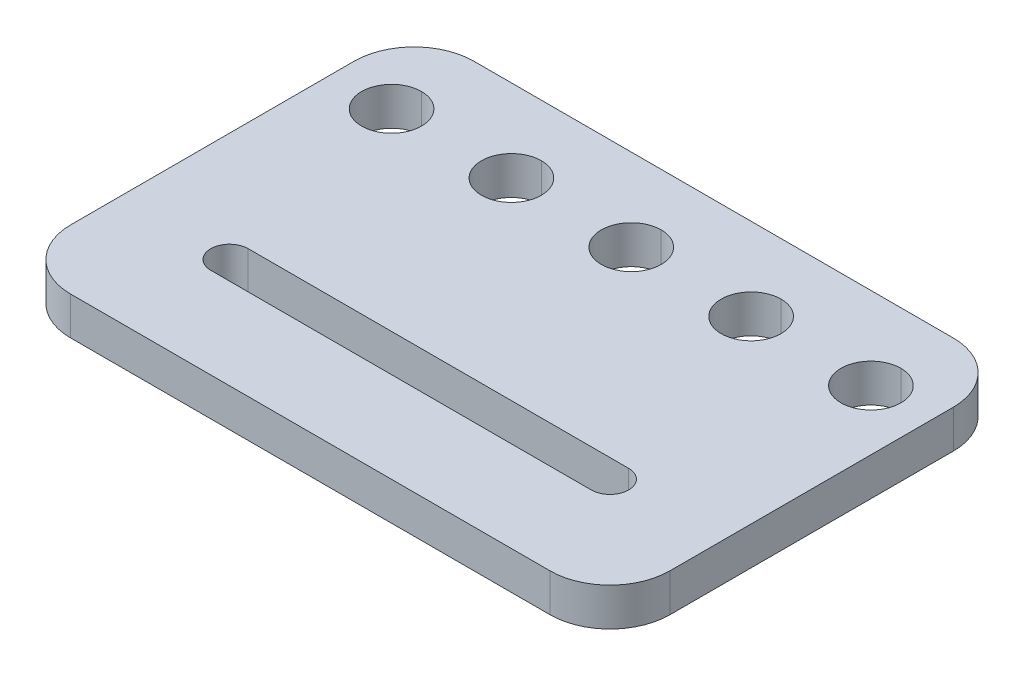
ISO-10303-21;
HEADER;
FILE_DESCRIPTION(('STEP AP214'),'2;1');
FILE_NAME('part.step','',(''),(''),'','','');
FILE_SCHEMA(('AUTOMOTIVE_DESIGN { 1 0 10303 214 1 1 1 1 }'));
ENDSEC;
DATA;
#1=APPLICATION_CONTEXT('core data for automotive mechanical design processes');
#2=APPLICATION_PROTOCOL_DEFINITION('international standard','automotive_design',2000,#1);
#3=PRODUCT_CONTEXT('',#1,'mechanical');
#4=PRODUCT('Part','Part','',(#3));
#5=PRODUCT_RELATED_PRODUCT_CATEGORY('part','',(#4));
#6=PRODUCT_DEFINITION_FORMATION('','',#4);
#7=PRODUCT_DEFINITION_CONTEXT('part definition',#1,'design');
#8=PRODUCT_DEFINITION('design','',#6,#7);
#9=PRODUCT_DEFINITION_SHAPE('','',#8);
#10=(LENGTH_UNIT() NAMED_UNIT(*) SI_UNIT(.MILLI.,.METRE.));
#11=(NAMED_UNIT(*) PLANE_ANGLE_UNIT() SI_UNIT($,.RADIAN.));
#12=(NAMED_UNIT(*) SI_UNIT($,.STERADIAN.) SOLID_ANGLE_UNIT());
#13=UNCERTAINTY_MEASURE_WITH_UNIT(LENGTH_MEASURE(1.E-05),#10,'distance_accuracy_value','');
#14=(GEOMETRIC_REPRESENTATION_CONTEXT(3) GLOBAL_UNCERTAINTY_ASSIGNED_CONTEXT((#13)) GLOBAL_UNIT_ASSIGNED_CONTEXT((#10,
#11,#12)) REPRESENTATION_CONTEXT('',''));
#15=CARTESIAN_POINT('',(0.,0.,0.));
#16=DIRECTION('',(0.,0.,1.));
#17=DIRECTION('',(1.,0.,0.));
#18=AXIS2_PLACEMENT_3D('',#15,#16,#17);
#19=CARTESIAN_POINT('',(20.,2.54,2.));
#20=DIRECTION('',(0.,-1.,0.));
#21=DIRECTION('',(0.,0.,-1.));
#22=AXIS2_PLACEMENT_3D('',#19,#20,#21);
#23=CYLINDRICAL_SURFACE('',#22,2.);
#24=CARTESIAN_POINT('',(20.,2.54,2.));
#25=DIRECTION('',(0.,-1.,0.));
#26=DIRECTION('',(0.,0.,-1.));
#27=AXIS2_PLACEMENT_3D('',#24,#25,#26);
#28=CIRCLE('',#27,2.);
#29=CARTESIAN_POINT('',(20.,2.54,4.));
#30=VERTEX_POINT('',#29);
#31=CARTESIAN_POINT('',(20.,2.54,0.));
#32=VERTEX_POINT('',#31);
#33=EDGE_CURVE('E41',#30,#32,#28,.T.);
#34=ORIENTED_EDGE('',*,*,#33,.F.);
#35=DIRECTION('',(0.,-1.,0.));
#36=VECTOR('',#35,1.);
#37=CARTESIAN_POINT('',(20.,2.54,4.));
#38=LINE('',#37,#36);
#39=CARTESIAN_POINT('',(20.,0.,4.));
#40=VERTEX_POINT('',#39);
#41=EDGE_CURVE('E11',#30,#40,#38,.T.);
#42=ORIENTED_EDGE('',*,*,#41,.T.);
#43=CARTESIAN_POINT('',(20.,0.,2.));
#44=DIRECTION('',(0.,-1.,0.));
#45=DIRECTION('',(0.,0.,-1.));
#46=AXIS2_PLACEMENT_3D('',#43,#44,#45);
#47=CIRCLE('',#46,2.);
#48=CARTESIAN_POINT('',(20.,0.,0.));
#49=VERTEX_POINT('',#48);
#50=EDGE_CURVE('E27',#40,#49,#47,.T.);
#51=ORIENTED_EDGE('',*,*,#50,.T.);
#52=DIRECTION('',(0.,-1.,0.));
#53=VECTOR('',#52,1.);
#54=CARTESIAN_POINT('',(20.,2.54,0.));
#55=LINE('',#54,#53);
#56=EDGE_CURVE('E333',#32,#49,#55,.T.);
#57=ORIENTED_EDGE('',*,*,#56,.F.);
#58=EDGE_LOOP('',(#34,#42,#51,#57));
#59=FACE_BOUND('',#58,.T.);
#60=ADVANCED_FACE('F16',(#59),#23,.F.);
#61=CARTESIAN_POINT('',(12.,2.54,2.));
#62=DIRECTION('',(0.,-1.,0.));
#63=DIRECTION('',(0.,0.,-1.));
#64=AXIS2_PLACEMENT_3D('',#61,#62,#63);
#65=CYLINDRICAL_SURFACE('',#64,2.);
#66=CARTESIAN_POINT('',(12.,2.54,2.));
#67=DIRECTION('',(0.,1.,0.));
#68=DIRECTION('',(0.,0.,1.));
#69=AXIS2_PLACEMENT_3D('',#66,#67,#68);
#70=CIRCLE('',#69,2.);
#71=CARTESIAN_POINT('',(12.,2.54,0.));
#72=VERTEX_POINT('',#71);
#73=CARTESIAN_POINT('',(12.,2.54,4.));
#74=VERTEX_POINT('',#73);
#75=EDGE_CURVE('E306',#72,#74,#70,.T.);
#76=ORIENTED_EDGE('',*,*,#75,.T.);
#77=DIRECTION('',(0.,-1.,0.));
#78=VECTOR('',#77,1.);
#79=CARTESIAN_POINT('',(12.,2.54,4.));
#80=LINE('',#79,#78);
#81=CARTESIAN_POINT('',(12.,0.,4.));
#82=VERTEX_POINT('',#81);
#83=EDGE_CURVE('E302',#74,#82,#80,.T.);
#84=ORIENTED_EDGE('',*,*,#83,.T.);
#85=CARTESIAN_POINT('',(12.,0.,2.));
#86=DIRECTION('',(0.,1.,0.));
#87=DIRECTION('',(0.,0.,1.));
#88=AXIS2_PLACEMENT_3D('',#85,#86,#87);
#89=CIRCLE('',#88,2.);
#90=CARTESIAN_POINT('',(12.,0.,0.));
#91=VERTEX_POINT('',#90);
#92=EDGE_CURVE('E287',#91,#82,#89,.T.);
#93=ORIENTED_EDGE('',*,*,#92,.F.);
#94=DIRECTION('',(0.,-1.,0.));
#95=VECTOR('',#94,1.);
#96=CARTESIAN_POINT('',(12.,2.54,0.));
#97=LINE('',#96,#95);
#98=EDGE_CURVE('E264',#72,#91,#97,.T.);
#99=ORIENTED_EDGE('',*,*,#98,.F.);
#100=EDGE_LOOP('',(#76,#84,#93,#99));
#101=FACE_BOUND('',#100,.T.);
#102=ADVANCED_FACE('F719',(#101),#65,.F.);
#103=CARTESIAN_POINT('',(4.,2.54,2.));
#104=DIRECTION('',(0.,-1.,0.));
#105=DIRECTION('',(0.,0.,-1.));
#106=AXIS2_PLACEMENT_3D('',#103,#104,#105);
#107=CYLINDRICAL_SURFACE('',#106,2.);
#108=CARTESIAN_POINT('',(4.,2.54,2.));
#109=DIRECTION('',(0.,1.,0.));
#110=DIRECTION('',(0.,0.,1.));
#111=AXIS2_PLACEMENT_3D('',#108,#109,#110);
#112=CIRCLE('',#111,2.);
#113=CARTESIAN_POINT('',(4.,2.54,0.));
#114=VERTEX_POINT('',#113);
#115=CARTESIAN_POINT('',(4.,2.54,4.));
#116=VERTEX_POINT('',#115);
#117=EDGE_CURVE('E307',#114,#116,#112,.T.);
#118=ORIENTED_EDGE('',*,*,#117,.T.);
#119=DIRECTION('',(0.,-1.,0.));
#120=VECTOR('',#119,1.);
#121=CARTESIAN_POINT('',(4.,2.54,4.));
#122=LINE('',#121,#120);
#123=CARTESIAN_POINT('',(4.,0.,4.));
#124=VERTEX_POINT('',#123);
#125=EDGE_CURVE('E312',#116,#124,#122,.T.);
#126=ORIENTED_EDGE('',*,*,#125,.T.);
#127=CARTESIAN_POINT('',(4.,0.,2.));
#128=DIRECTION('',(0.,1.,0.));
#129=DIRECTION('',(0.,0.,1.));
#130=AXIS2_PLACEMENT_3D('',#127,#128,#129);
#131=CIRCLE('',#130,2.);
#132=CARTESIAN_POINT('',(4.,0.,0.));
#133=VERTEX_POINT('',#132);
#134=EDGE_CURVE('E301',#133,#124,#131,.T.);
#135=ORIENTED_EDGE('',*,*,#134,.F.);
#136=DIRECTION('',(0.,-1.,0.));
#137=VECTOR('',#136,1.);
#138=CARTESIAN_POINT('',(4.,2.54,0.));
#139=LINE('',#138,#137);
#140=EDGE_CURVE('E263',#114,#133,#139,.T.);
#141=ORIENTED_EDGE('',*,*,#140,.F.);
#142=EDGE_LOOP('',(#118,#126,#135,#141));
#143=FACE_BOUND('',#142,.T.);
#144=ADVANCED_FACE('F723',(#143),#107,.F.);
#145=CARTESIAN_POINT('',(-4.,2.54,2.));
#146=DIRECTION('',(0.,-1.,0.));
#147=DIRECTION('',(0.,0.,-1.));
#148=AXIS2_PLACEMENT_3D('',#145,#146,#147);
#149=CYLINDRICAL_SURFACE('',#148,2.);
#150=CARTESIAN_POINT('',(-4.,2.54,2.));
#151=DIRECTION('',(0.,1.,0.));
#152=DIRECTION('',(0.,0.,1.));
#153=AXIS2_PLACEMENT_3D('',#150,#151,#152);
#154=CIRCLE('',#153,2.);
#155=CARTESIAN_POINT('',(-4.,2.54,0.));
#156=VERTEX_POINT('',#155);
#157=CARTESIAN_POINT('',(-4.,2.54,4.));
#158=VERTEX_POINT('',#157);
#159=EDGE_CURVE('E308',#156,#158,#154,.T.);
#160=ORIENTED_EDGE('',*,*,#159,.T.);
#161=DIRECTION('',(0.,-1.,0.));
#162=VECTOR('',#161,1.);
#163=CARTESIAN_POINT('',(-4.,2.54,4.));
#164=LINE('',#163,#162);
#165=CARTESIAN_POINT('',(-4.,0.,4.));
#166=VERTEX_POINT('',#165);
#167=EDGE_CURVE('E313',#158,#166,#164,.T.);
#168=ORIENTED_EDGE('',*,*,#167,.T.);
#169=CARTESIAN_POINT('',(-4.,0.,2.));
#170=DIRECTION('',(0.,1.,0.));
#171=DIRECTION('',(0.,0.,1.));
#172=AXIS2_PLACEMENT_3D('',#169,#170,#171);
#173=CIRCLE('',#172,2.);
#174=CARTESIAN_POINT('',(-4.,0.,0.));
#175=VERTEX_POINT('',#174);
#176=EDGE_CURVE('E286',#175,#166,#173,.T.);
#177=ORIENTED_EDGE('',*,*,#176,.F.);
#178=DIRECTION('',(0.,-1.,0.));
#179=VECTOR('',#178,1.);
#180=CARTESIAN_POINT('',(-4.,2.54,0.));
#181=LINE('',#180,#179);
#182=EDGE_CURVE('E318',#156,#175,#181,.T.);
#183=ORIENTED_EDGE('',*,*,#182,.F.);
#184=EDGE_LOOP('',(#160,#168,#177,#183));
#185=FACE_BOUND('',#184,.T.);
#186=ADVANCED_FACE('F693',(#185),#149,.F.);
#187=CARTESIAN_POINT('',(-12.,2.54,2.));
#188=DIRECTION('',(0.,-1.,0.));
#189=DIRECTION('',(0.,0.,-1.));
#190=AXIS2_PLACEMENT_3D('',#187,#188,#189);
#191=CYLINDRICAL_SURFACE('',#190,2.);
#192=CARTESIAN_POINT('',(-12.,2.54,2.));
#193=DIRECTION('',(0.,1.,0.));
#194=DIRECTION('',(0.,0.,1.));
#195=AXIS2_PLACEMENT_3D('',#192,#193,#194);
#196=CIRCLE('',#195,2.);
#197=CARTESIAN_POINT('',(-12.,2.54,0.));
#198=VERTEX_POINT('',#197);
#199=CARTESIAN_POINT('',(-12.,2.54,4.));
#200=VERTEX_POINT('',#199);
#201=EDGE_CURVE('E383',#198,#200,#196,.T.);
#202=ORIENTED_EDGE('',*,*,#201,.T.);
#203=DIRECTION('',(0.,-1.,0.));
#204=VECTOR('',#203,1.);
#205=CARTESIAN_POINT('',(-12.,2.54,4.));
#206=LINE('',#205,#204);
#207=CARTESIAN_POINT('',(-12.,0.,4.));
#208=VERTEX_POINT('',#207);
#209=EDGE_CURVE('E358',#200,#208,#206,.T.);
#210=ORIENTED_EDGE('',*,*,#209,.T.);
#211=CARTESIAN_POINT('',(-12.,0.,2.));
#212=DIRECTION('',(0.,1.,0.));
#213=DIRECTION('',(0.,0.,1.));
#214=AXIS2_PLACEMENT_3D('',#211,#212,#213);
#215=CIRCLE('',#214,2.);
#216=CARTESIAN_POINT('',(-12.,0.,0.));
#217=VERTEX_POINT('',#216);
#218=EDGE_CURVE('E265',#217,#208,#215,.T.);
#219=ORIENTED_EDGE('',*,*,#218,.F.);
#220=DIRECTION('',(0.,-1.,0.));
#221=VECTOR('',#220,1.);
#222=CARTESIAN_POINT('',(-12.,2.54,0.));
#223=LINE('',#222,#221);
#224=EDGE_CURVE('E258',#198,#217,#223,.T.);
#225=ORIENTED_EDGE('',*,*,#224,.F.);
#226=EDGE_LOOP('',(#202,#210,#219,#225));
#227=FACE_BOUND('',#226,.T.);
#228=ADVANCED_FACE('F688',(#227),#191,.F.);
#229=CARTESIAN_POINT('',(0.,2.54,0.));
#230=DIRECTION('',(0.,-1.,0.));
#231=DIRECTION('',(0.,0.,-1.));
#232=AXIS2_PLACEMENT_3D('',#229,#230,#231);
#233=PLANE('',#232);
#234=DIRECTION('',(1.,0.,0.));
#235=VECTOR('',#234,1.);
#236=CARTESIAN_POINT('',(0.,2.54,23.42));
#237=LINE('',#236,#235);
#238=CARTESIAN_POINT('',(-12.,2.54,23.42));
#239=VERTEX_POINT('',#238);
#240=CARTESIAN_POINT('',(20.,2.54,23.42));
#241=VERTEX_POINT('',#240);
#242=EDGE_CURVE('E280',#239,#241,#237,.T.);
#243=ORIENTED_EDGE('',*,*,#242,.T.);
#244=CARTESIAN_POINT('',(20.,2.54,19.42));
#245=DIRECTION('',(0.,1.,0.));
#246=DIRECTION('',(0.,0.,-1.));
#247=AXIS2_PLACEMENT_3D('',#244,#245,#246);
#248=CIRCLE('',#247,4.);
#249=CARTESIAN_POINT('',(24.,2.54,19.42));
#250=VERTEX_POINT('',#249);
#251=EDGE_CURVE('E276',#241,#250,#248,.T.);
#252=ORIENTED_EDGE('',*,*,#251,.T.);
#253=DIRECTION('',(0.,0.,-1.));
#254=VECTOR('',#253,1.);
#255=CARTESIAN_POINT('',(24.,2.54,6.));
#256=LINE('',#255,#254);
#257=CARTESIAN_POINT('',(24.,2.54,0.5));
#258=VERTEX_POINT('',#257);
#259=EDGE_CURVE('E281',#250,#258,#256,.T.);
#260=ORIENTED_EDGE('',*,*,#259,.T.);
#261=CARTESIAN_POINT('',(20.,2.54,0.5));
#262=DIRECTION('',(0.,1.,0.));
#263=DIRECTION('',(0.,0.,-1.));
#264=AXIS2_PLACEMENT_3D('',#261,#262,#263);
#265=CIRCLE('',#264,4.);
#266=CARTESIAN_POINT('',(20.,2.54,-3.5));
#267=VERTEX_POINT('',#266);
#268=EDGE_CURVE('E367',#258,#267,#265,.T.);
#269=ORIENTED_EDGE('',*,*,#268,.T.);
#270=DIRECTION('',(1.,0.,0.));
#271=VECTOR('',#270,1.);
#272=CARTESIAN_POINT('',(0.,2.54,-3.5));
#273=LINE('',#272,#271);
#274=CARTESIAN_POINT('',(-12.,2.54,-3.5));
#275=VERTEX_POINT('',#274);
#276=EDGE_CURVE('E336',#275,#267,#273,.T.);
#277=ORIENTED_EDGE('',*,*,#276,.F.);
#278=CARTESIAN_POINT('',(-12.,2.54,0.5));
#279=DIRECTION('',(0.,1.,0.));
#280=DIRECTION('',(0.,0.,-1.));
#281=AXIS2_PLACEMENT_3D('',#278,#279,#280);
#282=CIRCLE('',#281,4.);
#283=CARTESIAN_POINT('',(-16.,2.54,0.5));
#284=VERTEX_POINT('',#283);
#285=EDGE_CURVE('E363',#275,#284,#282,.T.);
#286=ORIENTED_EDGE('',*,*,#285,.T.);
#287=DIRECTION('',(0.,0.,1.));
#288=VECTOR('',#287,1.);
#289=CARTESIAN_POINT('',(-16.,2.54,-6.));
#290=LINE('',#289,#288);
#291=CARTESIAN_POINT('',(-16.,2.54,19.42));
#292=VERTEX_POINT('',#291);
#293=EDGE_CURVE('E368',#284,#292,#290,.T.);
#294=ORIENTED_EDGE('',*,*,#293,.T.);
#295=CARTESIAN_POINT('',(-12.,2.54,19.42));
#296=DIRECTION('',(0.,1.,0.));
#297=DIRECTION('',(0.,0.,-1.));
#298=AXIS2_PLACEMENT_3D('',#295,#296,#297);
#299=CIRCLE('',#298,4.);
#300=EDGE_CURVE('E387',#292,#239,#299,.T.);
#301=ORIENTED_EDGE('',*,*,#300,.T.);
#302=EDGE_LOOP('',(#243,#252,#260,#269,#277,#286,#294,#301));
#303=FACE_BOUND('',#302,.T.);
#304=DIRECTION('',(-1.,0.,0.));
#305=VECTOR('',#304,1.);
#306=CARTESIAN_POINT('',(-8.7,2.54,14.87));
#307=LINE('',#306,#305);
#308=CARTESIAN_POINT('',(16.7,2.54,14.87));
#309=VERTEX_POINT('',#308);
#310=CARTESIAN_POINT('',(-8.7,2.54,14.87));
#311=VERTEX_POINT('',#310);
#312=EDGE_CURVE('E293',#309,#311,#307,.T.);
#313=ORIENTED_EDGE('',*,*,#312,.F.);
#314=CARTESIAN_POINT('',(16.7,2.54,16.12));
#315=DIRECTION('',(0.,1.,0.));
#316=DIRECTION('',(0.,0.,-1.));
#317=AXIS2_PLACEMENT_3D('',#314,#315,#316);
#318=CIRCLE('',#317,1.25);
#319=CARTESIAN_POINT('',(16.7,2.54,17.37));
#320=VERTEX_POINT('',#319);
#321=EDGE_CURVE('E232',#320,#309,#318,.T.);
#322=ORIENTED_EDGE('',*,*,#321,.F.);
#323=DIRECTION('',(1.,0.,0.));
#324=VECTOR('',#323,1.);
#325=CARTESIAN_POINT('',(-8.7,2.54,17.37));
#326=LINE('',#325,#324);
#327=CARTESIAN_POINT('',(-8.7,2.54,17.37));
#328=VERTEX_POINT('',#327);
#329=EDGE_CURVE('E223',#328,#320,#326,.T.);
#330=ORIENTED_EDGE('',*,*,#329,.F.);
#331=CARTESIAN_POINT('',(-8.7,2.54,16.12));
#332=DIRECTION('',(0.,1.,0.));
#333=DIRECTION('',(0.,0.,-1.));
#334=AXIS2_PLACEMENT_3D('',#331,#332,#333);
#335=CIRCLE('',#334,1.25);
#336=EDGE_CURVE('E349',#311,#328,#335,.T.);
#337=ORIENTED_EDGE('',*,*,#336,.F.);
#338=EDGE_LOOP('',(#313,#322,#330,#337));
#339=FACE_BOUND('',#338,.T.);
#340=ORIENTED_EDGE('',*,*,#75,.F.);
#341=CARTESIAN_POINT('',(12.,2.54,2.));
#342=DIRECTION('',(0.,1.,0.));
#343=DIRECTION('',(0.,0.,1.));
#344=AXIS2_PLACEMENT_3D('',#341,#342,#343);
#345=CIRCLE('',#344,2.);
#346=EDGE_CURVE('E259',#74,#72,#345,.T.);
#347=ORIENTED_EDGE('',*,*,#346,.F.);
#348=EDGE_LOOP('',(#340,#347));
#349=FACE_BOUND('',#348,.T.);
#350=ORIENTED_EDGE('',*,*,#117,.F.);
#351=CARTESIAN_POINT('',(4.,2.54,2.));
#352=DIRECTION('',(0.,1.,0.));
#353=DIRECTION('',(0.,0.,1.));
#354=AXIS2_PLACEMENT_3D('',#351,#352,#353);
#355=CIRCLE('',#354,2.);
#356=EDGE_CURVE('E296',#116,#114,#355,.T.);
#357=ORIENTED_EDGE('',*,*,#356,.F.);
#358=EDGE_LOOP('',(#350,#357));
#359=FACE_BOUND('',#358,.T.);
#360=ORIENTED_EDGE('',*,*,#159,.F.);
#361=CARTESIAN_POINT('',(-4.,2.54,2.));
#362=DIRECTION('',(0.,1.,0.));
#363=DIRECTION('',(0.,0.,1.));
#364=AXIS2_PLACEMENT_3D('',#361,#362,#363);
#365=CIRCLE('',#364,2.);
#366=EDGE_CURVE('E321',#158,#156,#365,.T.);
#367=ORIENTED_EDGE('',*,*,#366,.F.);
#368=EDGE_LOOP('',(#360,#367));
#369=FACE_BOUND('',#368,.T.);
#370=ORIENTED_EDGE('',*,*,#201,.F.);
#371=CARTESIAN_POINT('',(-12.,2.54,2.));
#372=DIRECTION('',(0.,1.,0.));
#373=DIRECTION('',(0.,0.,1.));
#374=AXIS2_PLACEMENT_3D('',#371,#372,#373);
#375=CIRCLE('',#374,2.);
#376=EDGE_CURVE('E253',#200,#198,#375,.T.);
#377=ORIENTED_EDGE('',*,*,#376,.F.);
#378=EDGE_LOOP('',(#370,#377));
#379=FACE_BOUND('',#378,.T.);
#380=CARTESIAN_POINT('',(20.,2.54,2.));
#381=DIRECTION('',(0.,-1.,0.));
#382=DIRECTION('',(0.,0.,-1.));
#383=AXIS2_PLACEMENT_3D('',#380,#381,#382);
#384=CIRCLE('',#383,2.);
#385=EDGE_CURVE('E329',#32,#30,#384,.T.);
#386=ORIENTED_EDGE('',*,*,#385,.T.);
#387=ORIENTED_EDGE('',*,*,#33,.T.);
#388=EDGE_LOOP('',(#386,#387));
#389=FACE_BOUND('',#388,.T.);
#390=ADVANCED_FACE('F692',(#303,#339,#349,#359,#369,#379,#389),#233,.F.);
#391=CARTESIAN_POINT('',(0.,0.,0.));
#392=DIRECTION('',(0.,-1.,0.));
#393=DIRECTION('',(0.,0.,-1.));
#394=AXIS2_PLACEMENT_3D('',#391,#392,#393);
#395=PLANE('',#394);
#396=DIRECTION('',(0.,0.,1.));
#397=VECTOR('',#396,1.);
#398=CARTESIAN_POINT('',(24.,0.,6.));
#399=LINE('',#398,#397);
#400=CARTESIAN_POINT('',(24.,0.,0.5));
#401=VERTEX_POINT('',#400);
#402=CARTESIAN_POINT('',(24.,0.,19.42));
#403=VERTEX_POINT('',#402);
#404=EDGE_CURVE('E247',#401,#403,#399,.T.);
#405=ORIENTED_EDGE('',*,*,#404,.T.);
#406=CARTESIAN_POINT('',(20.,0.,19.42));
#407=DIRECTION('',(0.,-1.,0.));
#408=DIRECTION('',(0.,0.,-1.));
#409=AXIS2_PLACEMENT_3D('',#406,#407,#408);
#410=CIRCLE('',#409,4.);
#411=CARTESIAN_POINT('',(20.,0.,23.42));
#412=VERTEX_POINT('',#411);
#413=EDGE_CURVE('E249',#403,#412,#410,.T.);
#414=ORIENTED_EDGE('',*,*,#413,.T.);
#415=DIRECTION('',(1.,0.,0.));
#416=VECTOR('',#415,1.);
#417=CARTESIAN_POINT('',(0.,0.,23.42));
#418=LINE('',#417,#416);
#419=CARTESIAN_POINT('',(-12.,0.,23.42));
#420=VERTEX_POINT('',#419);
#421=EDGE_CURVE('E340',#420,#412,#418,.T.);
#422=ORIENTED_EDGE('',*,*,#421,.F.);
#423=CARTESIAN_POINT('',(-12.,0.,19.42));
#424=DIRECTION('',(0.,-1.,0.));
#425=DIRECTION('',(0.,0.,-1.));
#426=AXIS2_PLACEMENT_3D('',#423,#424,#425);
#427=CIRCLE('',#426,4.);
#428=CARTESIAN_POINT('',(-16.,0.,19.42));
#429=VERTEX_POINT('',#428);
#430=EDGE_CURVE('E252',#420,#429,#427,.T.);
#431=ORIENTED_EDGE('',*,*,#430,.T.);
#432=DIRECTION('',(0.,0.,1.));
#433=VECTOR('',#432,1.);
#434=CARTESIAN_POINT('',(-16.,0.,-6.));
#435=LINE('',#434,#433);
#436=CARTESIAN_POINT('',(-16.,0.,0.5));
#437=VERTEX_POINT('',#436);
#438=EDGE_CURVE('E274',#437,#429,#435,.T.);
#439=ORIENTED_EDGE('',*,*,#438,.F.);
#440=CARTESIAN_POINT('',(-12.,0.,0.5));
#441=DIRECTION('',(0.,-1.,0.));
#442=DIRECTION('',(0.,0.,-1.));
#443=AXIS2_PLACEMENT_3D('',#440,#441,#442);
#444=CIRCLE('',#443,4.);
#445=CARTESIAN_POINT('',(-12.,0.,-3.5));
#446=VERTEX_POINT('',#445);
#447=EDGE_CURVE('E362',#437,#446,#444,.T.);
#448=ORIENTED_EDGE('',*,*,#447,.T.);
#449=DIRECTION('',(1.,0.,0.));
#450=VECTOR('',#449,1.);
#451=CARTESIAN_POINT('',(0.,0.,-3.5));
#452=LINE('',#451,#450);
#453=CARTESIAN_POINT('',(20.,0.,-3.5));
#454=VERTEX_POINT('',#453);
#455=EDGE_CURVE('E300',#446,#454,#452,.T.);
#456=ORIENTED_EDGE('',*,*,#455,.T.);
#457=CARTESIAN_POINT('',(20.,0.,0.5));
#458=DIRECTION('',(0.,-1.,0.));
#459=DIRECTION('',(0.,0.,-1.));
#460=AXIS2_PLACEMENT_3D('',#457,#458,#459);
#461=CIRCLE('',#460,4.);
#462=EDGE_CURVE('E297',#454,#401,#461,.T.);
#463=ORIENTED_EDGE('',*,*,#462,.T.);
#464=EDGE_LOOP('',(#405,#414,#422,#431,#439,#448,#456,#463));
#465=FACE_BOUND('',#464,.T.);
#466=CARTESIAN_POINT('',(20.,0.,2.));
#467=DIRECTION('',(0.,-1.,0.));
#468=DIRECTION('',(0.,0.,-1.));
#469=AXIS2_PLACEMENT_3D('',#466,#467,#468);
#470=CIRCLE('',#469,2.);
#471=EDGE_CURVE('E20',#49,#40,#470,.T.);
#472=ORIENTED_EDGE('',*,*,#471,.F.);
#473=ORIENTED_EDGE('',*,*,#50,.F.);
#474=EDGE_LOOP('',(#472,#473));
#475=FACE_BOUND('',#474,.T.);
#476=ORIENTED_EDGE('',*,*,#134,.T.);
#477=CARTESIAN_POINT('',(4.,0.,2.));
#478=DIRECTION('',(0.,1.,0.));
#479=DIRECTION('',(0.,0.,1.));
#480=AXIS2_PLACEMENT_3D('',#477,#478,#479);
#481=CIRCLE('',#480,2.);
#482=EDGE_CURVE('E267',#124,#133,#481,.T.);
#483=ORIENTED_EDGE('',*,*,#482,.T.);
#484=EDGE_LOOP('',(#476,#483));
#485=FACE_BOUND('',#484,.T.);
#486=ORIENTED_EDGE('',*,*,#218,.T.);
#487=CARTESIAN_POINT('',(-12.,0.,2.));
#488=DIRECTION('',(0.,1.,0.));
#489=DIRECTION('',(0.,0.,1.));
#490=AXIS2_PLACEMENT_3D('',#487,#488,#489);
#491=CIRCLE('',#490,2.);
#492=EDGE_CURVE('E268',#208,#217,#491,.T.);
#493=ORIENTED_EDGE('',*,*,#492,.T.);
#494=EDGE_LOOP('',(#486,#493));
#495=FACE_BOUND('',#494,.T.);
#496=ORIENTED_EDGE('',*,*,#176,.T.);
#497=CARTESIAN_POINT('',(-4.,0.,2.));
#498=DIRECTION('',(0.,1.,0.));
#499=DIRECTION('',(0.,0.,1.));
#500=AXIS2_PLACEMENT_3D('',#497,#498,#499);
#501=CIRCLE('',#500,2.);
#502=EDGE_CURVE('E282',#166,#175,#501,.T.);
#503=ORIENTED_EDGE('',*,*,#502,.T.);
#504=EDGE_LOOP('',(#496,#503));
#505=FACE_BOUND('',#504,.T.);
#506=ORIENTED_EDGE('',*,*,#92,.T.);
#507=CARTESIAN_POINT('',(12.,0.,2.));
#508=DIRECTION('',(0.,1.,0.));
#509=DIRECTION('',(0.,0.,1.));
#510=AXIS2_PLACEMENT_3D('',#507,#508,#509);
#511=CIRCLE('',#510,2.);
#512=EDGE_CURVE('E369',#82,#91,#511,.T.);
#513=ORIENTED_EDGE('',*,*,#512,.T.);
#514=EDGE_LOOP('',(#506,#513));
#515=FACE_BOUND('',#514,.T.);
#516=CARTESIAN_POINT('',(-8.7,0.,16.12));
#517=DIRECTION('',(0.,-1.,0.));
#518=DIRECTION('',(0.,0.,-1.));
#519=AXIS2_PLACEMENT_3D('',#516,#517,#518);
#520=CIRCLE('',#519,1.25);
#521=CARTESIAN_POINT('',(-8.7,0.,17.37));
#522=VERTEX_POINT('',#521);
#523=CARTESIAN_POINT('',(-8.7,0.,14.87));
#524=VERTEX_POINT('',#523);
#525=EDGE_CURVE('E322',#522,#524,#520,.T.);
#526=ORIENTED_EDGE('',*,*,#525,.F.);
#527=DIRECTION('',(-1.,0.,0.));
#528=VECTOR('',#527,1.);
#529=CARTESIAN_POINT('',(-8.7,0.,17.37));
#530=LINE('',#529,#528);
#531=CARTESIAN_POINT('',(16.7,0.,17.37));
#532=VERTEX_POINT('',#531);
#533=EDGE_CURVE('E216',#532,#522,#530,.T.);
#534=ORIENTED_EDGE('',*,*,#533,.F.);
#535=CARTESIAN_POINT('',(16.7,0.,16.12));
#536=DIRECTION('',(0.,-1.,0.));
#537=DIRECTION('',(0.,0.,-1.));
#538=AXIS2_PLACEMENT_3D('',#535,#536,#537);
#539=CIRCLE('',#538,1.25);
#540=CARTESIAN_POINT('',(16.7,0.,14.87));
#541=VERTEX_POINT('',#540);
#542=EDGE_CURVE('E210',#541,#532,#539,.T.);
#543=ORIENTED_EDGE('',*,*,#542,.F.);
#544=DIRECTION('',(1.,0.,0.));
#545=VECTOR('',#544,1.);
#546=CARTESIAN_POINT('',(-8.7,0.,14.87));
#547=LINE('',#546,#545);
#548=EDGE_CURVE('E213',#524,#541,#547,.T.);
#549=ORIENTED_EDGE('',*,*,#548,.F.);
#550=EDGE_LOOP('',(#526,#534,#543,#549));
#551=FACE_BOUND('',#550,.T.);
#552=ADVANCED_FACE('F212',(#465,#475,#485,#495,#505,#515,#551),#395,.T.);
#553=CARTESIAN_POINT('',(-16.,2.54,-6.));
#554=DIRECTION('',(1.,0.,0.));
#555=DIRECTION('',(0.,1.,0.));
#556=AXIS2_PLACEMENT_3D('',#553,#554,#555);
#557=PLANE('',#556);
#558=ORIENTED_EDGE('',*,*,#438,.T.);
#559=DIRECTION('',(0.,1.,0.));
#560=VECTOR('',#559,1.);
#561=CARTESIAN_POINT('',(-16.,2.54,19.42));
#562=LINE('',#561,#560);
#563=EDGE_CURVE('E270',#429,#292,#562,.T.);
#564=ORIENTED_EDGE('',*,*,#563,.T.);
#565=ORIENTED_EDGE('',*,*,#293,.F.);
#566=DIRECTION('',(0.,-1.,0.));
#567=VECTOR('',#566,1.);
#568=CARTESIAN_POINT('',(-16.,0.,0.5));
#569=LINE('',#568,#567);
#570=EDGE_CURVE('E275',#284,#437,#569,.T.);
#571=ORIENTED_EDGE('',*,*,#570,.T.);
#572=EDGE_LOOP('',(#558,#564,#565,#571));
#573=FACE_BOUND('',#572,.T.);
#574=ADVANCED_FACE('F749',(#573),#557,.F.);
#575=CARTESIAN_POINT('',(24.,16.9622051018559,6.));
#576=DIRECTION('',(1.,0.,0.));
#577=DIRECTION('',(0.,0.,1.));
#578=AXIS2_PLACEMENT_3D('',#575,#576,#577);
#579=PLANE('',#578);
#580=ORIENTED_EDGE('',*,*,#259,.F.);
#581=DIRECTION('',(0.,-1.,0.));
#582=VECTOR('',#581,1.);
#583=CARTESIAN_POINT('',(24.,0.,19.42));
#584=LINE('',#583,#582);
#585=EDGE_CURVE('E317',#250,#403,#584,.T.);
#586=ORIENTED_EDGE('',*,*,#585,.T.);
#587=ORIENTED_EDGE('',*,*,#404,.F.);
#588=DIRECTION('',(0.,1.,0.));
#589=VECTOR('',#588,1.);
#590=CARTESIAN_POINT('',(24.,16.9622051018559,0.5));
#591=LINE('',#590,#589);
#592=EDGE_CURVE('E257',#401,#258,#591,.T.);
#593=ORIENTED_EDGE('',*,*,#592,.T.);
#594=EDGE_LOOP('',(#580,#586,#587,#593));
#595=FACE_BOUND('',#594,.T.);
#596=ADVANCED_FACE('F484',(#595),#579,.T.);
#597=CARTESIAN_POINT('',(-12.,2.54,2.));
#598=DIRECTION('',(0.,-1.,0.));
#599=DIRECTION('',(0.,0.,-1.));
#600=AXIS2_PLACEMENT_3D('',#597,#598,#599);
#601=CYLINDRICAL_SURFACE('',#600,2.);
#602=ORIENTED_EDGE('',*,*,#209,.F.);
#603=ORIENTED_EDGE('',*,*,#376,.T.);
#604=ORIENTED_EDGE('',*,*,#224,.T.);
#605=ORIENTED_EDGE('',*,*,#492,.F.);
#606=EDGE_LOOP('',(#602,#603,#604,#605));
#607=FACE_BOUND('',#606,.T.);
#608=ADVANCED_FACE('F748',(#607),#601,.F.);
#609=CARTESIAN_POINT('',(-4.,2.54,2.));
#610=DIRECTION('',(0.,-1.,0.));
#611=DIRECTION('',(0.,0.,-1.));
#612=AXIS2_PLACEMENT_3D('',#609,#610,#611);
#613=CYLINDRICAL_SURFACE('',#612,2.);
#614=ORIENTED_EDGE('',*,*,#167,.F.);
#615=ORIENTED_EDGE('',*,*,#366,.T.);
#616=ORIENTED_EDGE('',*,*,#182,.T.);
#617=ORIENTED_EDGE('',*,*,#502,.F.);
#618=EDGE_LOOP('',(#614,#615,#616,#617));
#619=FACE_BOUND('',#618,.T.);
#620=ADVANCED_FACE('F713',(#619),#613,.F.);
#621=CARTESIAN_POINT('',(4.,2.54,2.));
#622=DIRECTION('',(0.,-1.,0.));
#623=DIRECTION('',(0.,0.,-1.));
#624=AXIS2_PLACEMENT_3D('',#621,#622,#623);
#625=CYLINDRICAL_SURFACE('',#624,2.);
#626=ORIENTED_EDGE('',*,*,#125,.F.);
#627=ORIENTED_EDGE('',*,*,#356,.T.);
#628=ORIENTED_EDGE('',*,*,#140,.T.);
#629=ORIENTED_EDGE('',*,*,#482,.F.);
#630=EDGE_LOOP('',(#626,#627,#628,#629));
#631=FACE_BOUND('',#630,.T.);
#632=ADVANCED_FACE('F704',(#631),#625,.F.);
#633=CARTESIAN_POINT('',(12.,2.54,2.));
#634=DIRECTION('',(0.,-1.,0.));
#635=DIRECTION('',(0.,0.,-1.));
#636=AXIS2_PLACEMENT_3D('',#633,#634,#635);
#637=CYLINDRICAL_SURFACE('',#636,2.);
#638=ORIENTED_EDGE('',*,*,#83,.F.);
#639=ORIENTED_EDGE('',*,*,#346,.T.);
#640=ORIENTED_EDGE('',*,*,#98,.T.);
#641=ORIENTED_EDGE('',*,*,#512,.F.);
#642=EDGE_LOOP('',(#638,#639,#640,#641));
#643=FACE_BOUND('',#642,.T.);
#644=ADVANCED_FACE('F699',(#643),#637,.F.);
#645=CARTESIAN_POINT('',(20.,2.54,2.));
#646=DIRECTION('',(0.,-1.,0.));
#647=DIRECTION('',(0.,0.,-1.));
#648=AXIS2_PLACEMENT_3D('',#645,#646,#647);
#649=CYLINDRICAL_SURFACE('',#648,2.);
#650=ORIENTED_EDGE('',*,*,#41,.F.);
#651=ORIENTED_EDGE('',*,*,#385,.F.);
#652=ORIENTED_EDGE('',*,*,#56,.T.);
#653=ORIENTED_EDGE('',*,*,#471,.T.);
#654=EDGE_LOOP('',(#650,#651,#652,#653));
#655=FACE_BOUND('',#654,.T.);
#656=ADVANCED_FACE('F703',(#655),#649,.F.);
#657=CARTESIAN_POINT('',(-8.7,47.3692047665358,14.87));
#658=DIRECTION('',(0.,0.,-1.));
#659=DIRECTION('',(0.,-1.,0.));
#660=AXIS2_PLACEMENT_3D('',#657,#658,#659);
#661=PLANE('',#660);
#662=DIRECTION('',(0.,-1.,0.));
#663=VECTOR('',#662,1.);
#664=CARTESIAN_POINT('',(16.7,47.3692047665358,14.87));
#665=LINE('',#664,#663);
#666=EDGE_CURVE('E222',#309,#541,#665,.T.);
#667=ORIENTED_EDGE('',*,*,#666,.F.);
#668=ORIENTED_EDGE('',*,*,#312,.T.);
#669=DIRECTION('',(0.,-1.,0.));
#670=VECTOR('',#669,1.);
#671=CARTESIAN_POINT('',(-8.7,47.3692047665358,14.87));
#672=LINE('',#671,#670);
#673=EDGE_CURVE('E230',#311,#524,#672,.T.);
#674=ORIENTED_EDGE('',*,*,#673,.T.);
#675=ORIENTED_EDGE('',*,*,#548,.T.);
#676=EDGE_LOOP('',(#667,#668,#674,#675));
#677=FACE_BOUND('',#676,.T.);
#678=ADVANCED_FACE('F227',(#677),#661,.F.);
#679=CARTESIAN_POINT('',(16.7,47.3692047665358,16.12));
#680=DIRECTION('',(0.,-1.,0.));
#681=DIRECTION('',(0.,0.,-1.));
#682=AXIS2_PLACEMENT_3D('',#679,#680,#681);
#683=CYLINDRICAL_SURFACE('',#682,1.25);
#684=DIRECTION('',(0.,-1.,0.));
#685=VECTOR('',#684,1.);
#686=CARTESIAN_POINT('',(16.7,47.3692047665358,17.37));
#687=LINE('',#686,#685);
#688=EDGE_CURVE('E290',#320,#532,#687,.T.);
#689=ORIENTED_EDGE('',*,*,#688,.F.);
#690=ORIENTED_EDGE('',*,*,#321,.T.);
#691=ORIENTED_EDGE('',*,*,#666,.T.);
#692=ORIENTED_EDGE('',*,*,#542,.T.);
#693=EDGE_LOOP('',(#689,#690,#691,#692));
#694=FACE_BOUND('',#693,.T.);
#695=ADVANCED_FACE('F234',(#694),#683,.F.);
#696=CARTESIAN_POINT('',(-8.7,47.3692047665358,17.37));
#697=DIRECTION('',(0.,0.,1.));
#698=DIRECTION('',(1.,0.,0.));
#699=AXIS2_PLACEMENT_3D('',#696,#697,#698);
#700=PLANE('',#699);
#701=DIRECTION('',(0.,-1.,0.));
#702=VECTOR('',#701,1.);
#703=CARTESIAN_POINT('',(-8.7,47.3692047665358,17.37));
#704=LINE('',#703,#702);
#705=EDGE_CURVE('E325',#328,#522,#704,.T.);
#706=ORIENTED_EDGE('',*,*,#705,.F.);
#707=ORIENTED_EDGE('',*,*,#329,.T.);
#708=ORIENTED_EDGE('',*,*,#688,.T.);
#709=ORIENTED_EDGE('',*,*,#533,.T.);
#710=EDGE_LOOP('',(#706,#707,#708,#709));
#711=FACE_BOUND('',#710,.T.);
#712=ADVANCED_FACE('F817',(#711),#700,.F.);
#713=CARTESIAN_POINT('',(-8.7,47.3692047665358,16.12));
#714=DIRECTION('',(0.,-1.,0.));
#715=DIRECTION('',(0.,0.,-1.));
#716=AXIS2_PLACEMENT_3D('',#713,#714,#715);
#717=CYLINDRICAL_SURFACE('',#716,1.25);
#718=ORIENTED_EDGE('',*,*,#673,.F.);
#719=ORIENTED_EDGE('',*,*,#336,.T.);
#720=ORIENTED_EDGE('',*,*,#705,.T.);
#721=ORIENTED_EDGE('',*,*,#525,.T.);
#722=EDGE_LOOP('',(#718,#719,#720,#721));
#723=FACE_BOUND('',#722,.T.);
#724=ADVANCED_FACE('F683',(#723),#717,.F.);
#725=CARTESIAN_POINT('',(0.,2.54,-3.5));
#726=DIRECTION('',(0.,0.,-1.));
#727=DIRECTION('',(0.,-1.,0.));
#728=AXIS2_PLACEMENT_3D('',#725,#726,#727);
#729=PLANE('',#728);
#730=ORIENTED_EDGE('',*,*,#455,.F.);
#731=DIRECTION('',(0.,1.,0.));
#732=VECTOR('',#731,1.);
#733=CARTESIAN_POINT('',(-12.,2.54,-3.5));
#734=LINE('',#733,#732);
#735=EDGE_CURVE('E326',#446,#275,#734,.T.);
#736=ORIENTED_EDGE('',*,*,#735,.T.);
#737=ORIENTED_EDGE('',*,*,#276,.T.);
#738=DIRECTION('',(0.,-1.,0.));
#739=VECTOR('',#738,1.);
#740=CARTESIAN_POINT('',(20.,2.54,-3.5));
#741=LINE('',#740,#739);
#742=EDGE_CURVE('E339',#267,#454,#741,.T.);
#743=ORIENTED_EDGE('',*,*,#742,.T.);
#744=EDGE_LOOP('',(#730,#736,#737,#743));
#745=FACE_BOUND('',#744,.T.);
#746=ADVANCED_FACE('F476',(#745),#729,.T.);
#747=CARTESIAN_POINT('',(0.,2.54,23.42));
#748=DIRECTION('',(0.,0.,-1.));
#749=DIRECTION('',(0.,-1.,0.));
#750=AXIS2_PLACEMENT_3D('',#747,#748,#749);
#751=PLANE('',#750);
#752=ORIENTED_EDGE('',*,*,#421,.T.);
#753=DIRECTION('',(0.,1.,0.));
#754=VECTOR('',#753,1.);
#755=CARTESIAN_POINT('',(20.,2.54,23.42));
#756=LINE('',#755,#754);
#757=EDGE_CURVE('E343',#412,#241,#756,.T.);
#758=ORIENTED_EDGE('',*,*,#757,.T.);
#759=ORIENTED_EDGE('',*,*,#242,.F.);
#760=DIRECTION('',(0.,-1.,0.));
#761=VECTOR('',#760,1.);
#762=CARTESIAN_POINT('',(-12.,2.54,23.42));
#763=LINE('',#762,#761);
#764=EDGE_CURVE('E399',#239,#420,#763,.T.);
#765=ORIENTED_EDGE('',*,*,#764,.T.);
#766=EDGE_LOOP('',(#752,#758,#759,#765));
#767=FACE_BOUND('',#766,.T.);
#768=ADVANCED_FACE('F18',(#767),#751,.F.);
#769=CARTESIAN_POINT('',(20.,16.9622051018559,19.42));
#770=DIRECTION('',(0.,1.,0.));
#771=DIRECTION('',(0.,0.,1.));
#772=AXIS2_PLACEMENT_3D('',#769,#770,#771);
#773=CYLINDRICAL_SURFACE('',#772,4.);
#774=ORIENTED_EDGE('',*,*,#251,.F.);
#775=ORIENTED_EDGE('',*,*,#757,.F.);
#776=ORIENTED_EDGE('',*,*,#413,.F.);
#777=ORIENTED_EDGE('',*,*,#585,.F.);
#778=EDGE_LOOP('',(#774,#775,#776,#777));
#779=FACE_BOUND('',#778,.T.);
#780=ADVANCED_FACE('F830',(#779),#773,.T.);
#781=CARTESIAN_POINT('',(-12.,2.54,19.42));
#782=DIRECTION('',(0.,-1.,0.));
#783=DIRECTION('',(0.,0.,-1.));
#784=AXIS2_PLACEMENT_3D('',#781,#782,#783);
#785=CYLINDRICAL_SURFACE('',#784,4.);
#786=ORIENTED_EDGE('',*,*,#300,.F.);
#787=ORIENTED_EDGE('',*,*,#563,.F.);
#788=ORIENTED_EDGE('',*,*,#430,.F.);
#789=ORIENTED_EDGE('',*,*,#764,.F.);
#790=EDGE_LOOP('',(#786,#787,#788,#789));
#791=FACE_BOUND('',#790,.T.);
#792=ADVANCED_FACE('F834',(#791),#785,.T.);
#793=CARTESIAN_POINT('',(-12.,2.54,0.5));
#794=DIRECTION('',(0.,1.,0.));
#795=DIRECTION('',(0.,0.,1.));
#796=AXIS2_PLACEMENT_3D('',#793,#794,#795);
#797=CYLINDRICAL_SURFACE('',#796,4.);
#798=ORIENTED_EDGE('',*,*,#285,.F.);
#799=ORIENTED_EDGE('',*,*,#735,.F.);
#800=ORIENTED_EDGE('',*,*,#447,.F.);
#801=ORIENTED_EDGE('',*,*,#570,.F.);
#802=EDGE_LOOP('',(#798,#799,#800,#801));
#803=FACE_BOUND('',#802,.T.);
#804=ADVANCED_FACE('F474',(#803),#797,.T.);
#805=CARTESIAN_POINT('',(20.,2.54,0.5));
#806=DIRECTION('',(0.,-1.,0.));
#807=DIRECTION('',(0.,0.,-1.));
#808=AXIS2_PLACEMENT_3D('',#805,#806,#807);
#809=CYLINDRICAL_SURFACE('',#808,4.);
#810=ORIENTED_EDGE('',*,*,#268,.F.);
#811=ORIENTED_EDGE('',*,*,#592,.F.);
#812=ORIENTED_EDGE('',*,*,#462,.F.);
#813=ORIENTED_EDGE('',*,*,#742,.F.);
#814=EDGE_LOOP('',(#810,#811,#812,#813));
#815=FACE_BOUND('',#814,.T.);
#816=ADVANCED_FACE('F480',(#815),#809,.T.);
#817=CLOSED_SHELL('',(#60,#102,#144,#186,#228,#390,#552,#574,#596,#608,#620,#632,#644,#656,#678,
#695,#712,#724,#746,#768,#780,#792,#804,#816));
#818=MANIFOLD_SOLID_BREP('B1',#817);
#819=ADVANCED_BREP_SHAPE_REPRESENTATION('',(#18,#818),#14);
#820=SHAPE_DEFINITION_REPRESENTATION(#9,#819);
ENDSEC;
END-ISO-10303-21;
